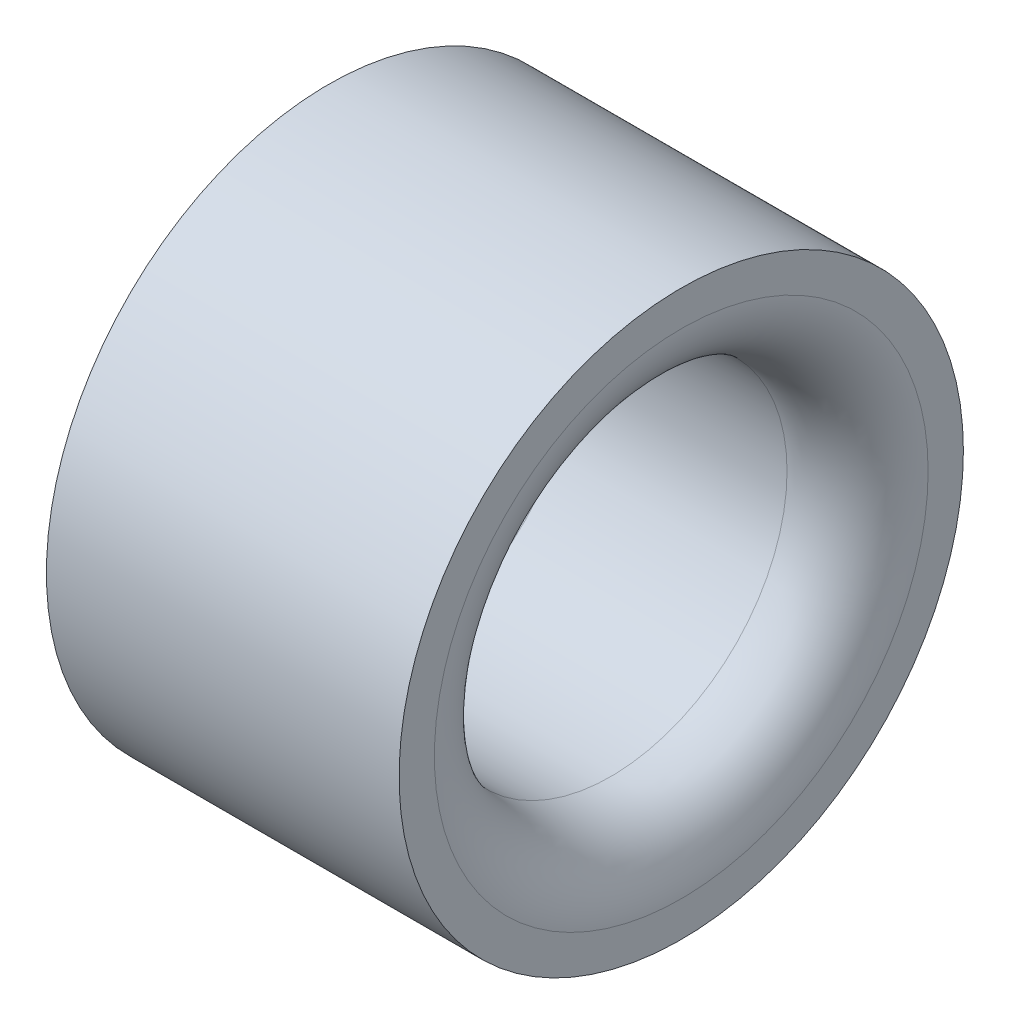
ISO-10303-21;
HEADER;
FILE_DESCRIPTION(('STEP AP214'),'2;1');
FILE_NAME('part.step','',(''),(''),'','','');
FILE_SCHEMA(('AUTOMOTIVE_DESIGN { 1 0 10303 214 1 1 1 1 }'));
ENDSEC;
DATA;
#1=APPLICATION_CONTEXT('core data for automotive mechanical design processes');
#2=APPLICATION_PROTOCOL_DEFINITION('international standard','automotive_design',2000,#1);
#3=PRODUCT_CONTEXT('',#1,'mechanical');
#4=PRODUCT('Part','Part','',(#3));
#5=PRODUCT_RELATED_PRODUCT_CATEGORY('part','',(#4));
#6=PRODUCT_DEFINITION_FORMATION('','',#4);
#7=PRODUCT_DEFINITION_CONTEXT('part definition',#1,'design');
#8=PRODUCT_DEFINITION('design','',#6,#7);
#9=PRODUCT_DEFINITION_SHAPE('','',#8);
#10=(LENGTH_UNIT() NAMED_UNIT(*) SI_UNIT(.MILLI.,.METRE.));
#11=(NAMED_UNIT(*) PLANE_ANGLE_UNIT() SI_UNIT($,.RADIAN.));
#12=(NAMED_UNIT(*) SI_UNIT($,.STERADIAN.) SOLID_ANGLE_UNIT());
#13=UNCERTAINTY_MEASURE_WITH_UNIT(LENGTH_MEASURE(1.E-05),#10,'distance_accuracy_value','');
#14=(GEOMETRIC_REPRESENTATION_CONTEXT(3) GLOBAL_UNCERTAINTY_ASSIGNED_CONTEXT((#13)) GLOBAL_UNIT_ASSIGNED_CONTEXT((#10,
#11,#12)) REPRESENTATION_CONTEXT('',''));
#15=CARTESIAN_POINT('',(0.,0.,0.));
#16=DIRECTION('',(0.,0.,1.));
#17=DIRECTION('',(1.,0.,0.));
#18=AXIS2_PLACEMENT_3D('',#15,#16,#17);
#19=CARTESIAN_POINT('',(5.,0.,0.));
#20=DIRECTION('',(1.,0.,0.));
#21=DIRECTION('',(0.,0.,-1.));
#22=AXIS2_PLACEMENT_3D('',#19,#20,#21);
#23=PLANE('',#22);
#24=CARTESIAN_POINT('',(5.,0.,0.));
#25=DIRECTION('',(1.,0.,0.));
#26=DIRECTION('',(0.,0.,-1.));
#27=AXIS2_PLACEMENT_3D('',#24,#25,#26);
#28=CIRCLE('',#27,3.5);
#29=CARTESIAN_POINT('',(5.,0.,-3.5));
#30=VERTEX_POINT('',#29);
#31=EDGE_CURVE('E10',#30,#30,#28,.F.);
#32=ORIENTED_EDGE('',*,*,#31,.T.);
#33=EDGE_LOOP('',(#32));
#34=FACE_BOUND('',#33,.T.);
#35=CARTESIAN_POINT('',(5.,0.,0.));
#36=DIRECTION('',(1.,0.,0.));
#37=DIRECTION('',(0.,0.,-1.));
#38=AXIS2_PLACEMENT_3D('',#35,#36,#37);
#39=CIRCLE('',#38,4.);
#40=CARTESIAN_POINT('',(5.,0.,-4.));
#41=VERTEX_POINT('',#40);
#42=EDGE_CURVE('E61',#41,#41,#39,.T.);
#43=ORIENTED_EDGE('',*,*,#42,.T.);
#44=EDGE_LOOP('',(#43));
#45=FACE_BOUND('',#44,.T.);
#46=ADVANCED_FACE('F37',(#34,#45),#23,.T.);
#47=CARTESIAN_POINT('',(0.,0.,0.));
#48=DIRECTION('',(1.,0.,0.));
#49=DIRECTION('',(0.,0.,-1.));
#50=AXIS2_PLACEMENT_3D('',#47,#48,#49);
#51=PLANE('',#50);
#52=CARTESIAN_POINT('',(0.,0.,0.));
#53=DIRECTION('',(1.,0.,0.));
#54=DIRECTION('',(0.,0.,-1.));
#55=AXIS2_PLACEMENT_3D('',#52,#53,#54);
#56=CIRCLE('',#55,3.5);
#57=CARTESIAN_POINT('',(0.,0.,-3.5));
#58=VERTEX_POINT('',#57);
#59=EDGE_CURVE('E55',#58,#58,#56,.T.);
#60=ORIENTED_EDGE('',*,*,#59,.T.);
#61=EDGE_LOOP('',(#60));
#62=FACE_BOUND('',#61,.T.);
#63=CARTESIAN_POINT('',(0.,0.,0.));
#64=DIRECTION('',(1.,0.,0.));
#65=DIRECTION('',(0.,0.,-1.));
#66=AXIS2_PLACEMENT_3D('',#63,#64,#65);
#67=CIRCLE('',#66,4.);
#68=CARTESIAN_POINT('',(0.,0.,-4.));
#69=VERTEX_POINT('',#68);
#70=EDGE_CURVE('E62',#69,#69,#67,.T.);
#71=ORIENTED_EDGE('',*,*,#70,.F.);
#72=EDGE_LOOP('',(#71));
#73=FACE_BOUND('',#72,.T.);
#74=ADVANCED_FACE('F75',(#62,#73),#51,.F.);
#75=CARTESIAN_POINT('',(5.,0.,0.));
#76=DIRECTION('',(-1.,0.,0.));
#77=DIRECTION('',(0.,0.,1.));
#78=AXIS2_PLACEMENT_3D('',#75,#76,#77);
#79=CYLINDRICAL_SURFACE('',#78,4.);
#80=ORIENTED_EDGE('',*,*,#42,.F.);
#81=EDGE_LOOP('',(#80));
#82=FACE_BOUND('',#81,.T.);
#83=ORIENTED_EDGE('',*,*,#70,.T.);
#84=EDGE_LOOP('',(#83));
#85=FACE_BOUND('',#84,.T.);
#86=ADVANCED_FACE('F71',(#82,#85),#79,.T.);
#87=CARTESIAN_POINT('',(5.,0.,0.));
#88=DIRECTION('',(-1.,0.,0.));
#89=DIRECTION('',(0.,0.,1.));
#90=AXIS2_PLACEMENT_3D('',#87,#88,#89);
#91=CYLINDRICAL_SURFACE('',#90,2.5);
#92=CARTESIAN_POINT('',(1.,0.,0.));
#93=DIRECTION('',(1.,0.,0.));
#94=DIRECTION('',(0.,0.,-1.));
#95=AXIS2_PLACEMENT_3D('',#92,#93,#94);
#96=CIRCLE('',#95,2.5);
#97=CARTESIAN_POINT('',(1.,0.,-2.5));
#98=VERTEX_POINT('',#97);
#99=EDGE_CURVE('E45',#98,#98,#96,.F.);
#100=ORIENTED_EDGE('',*,*,#99,.T.);
#101=EDGE_LOOP('',(#100));
#102=FACE_BOUND('',#101,.T.);
#103=CARTESIAN_POINT('',(4.,0.,0.));
#104=DIRECTION('',(1.,0.,0.));
#105=DIRECTION('',(0.,0.,-1.));
#106=AXIS2_PLACEMENT_3D('',#103,#104,#105);
#107=CIRCLE('',#106,2.5);
#108=CARTESIAN_POINT('',(4.,0.,-2.5));
#109=VERTEX_POINT('',#108);
#110=EDGE_CURVE('E50',#109,#109,#107,.T.);
#111=ORIENTED_EDGE('',*,*,#110,.T.);
#112=EDGE_LOOP('',(#111));
#113=FACE_BOUND('',#112,.T.);
#114=ADVANCED_FACE('F74',(#102,#113),#91,.F.);
#115=CARTESIAN_POINT('',(1.,0.,0.));
#116=DIRECTION('',(1.,0.,0.));
#117=DIRECTION('',(0.,0.,-1.));
#118=AXIS2_PLACEMENT_3D('',#115,#116,#117);
#119=TOROIDAL_SURFACE('',#118,3.5,1.);
#120=ORIENTED_EDGE('',*,*,#99,.F.);
#121=EDGE_LOOP('',(#120));
#122=FACE_BOUND('',#121,.T.);
#123=ORIENTED_EDGE('',*,*,#59,.F.);
#124=EDGE_LOOP('',(#123));
#125=FACE_BOUND('',#124,.T.);
#126=ADVANCED_FACE('F87',(#122,#125),#119,.T.);
#127=CARTESIAN_POINT('',(4.,0.,0.));
#128=DIRECTION('',(1.,0.,0.));
#129=DIRECTION('',(0.,0.,-1.));
#130=AXIS2_PLACEMENT_3D('',#127,#128,#129);
#131=TOROIDAL_SURFACE('',#130,3.5,1.);
#132=ORIENTED_EDGE('',*,*,#31,.F.);
#133=EDGE_LOOP('',(#132));
#134=FACE_BOUND('',#133,.T.);
#135=ORIENTED_EDGE('',*,*,#110,.F.);
#136=EDGE_LOOP('',(#135));
#137=FACE_BOUND('',#136,.T.);
#138=ADVANCED_FACE('F39',(#134,#137),#131,.T.);
#139=CLOSED_SHELL('',(#46,#74,#86,#114,#126,#138));
#140=MANIFOLD_SOLID_BREP('B2',#139);
#141=ADVANCED_BREP_SHAPE_REPRESENTATION('',(#18,#140),#14);
#142=SHAPE_DEFINITION_REPRESENTATION(#9,#141);
ENDSEC;
END-ISO-10303-21;
